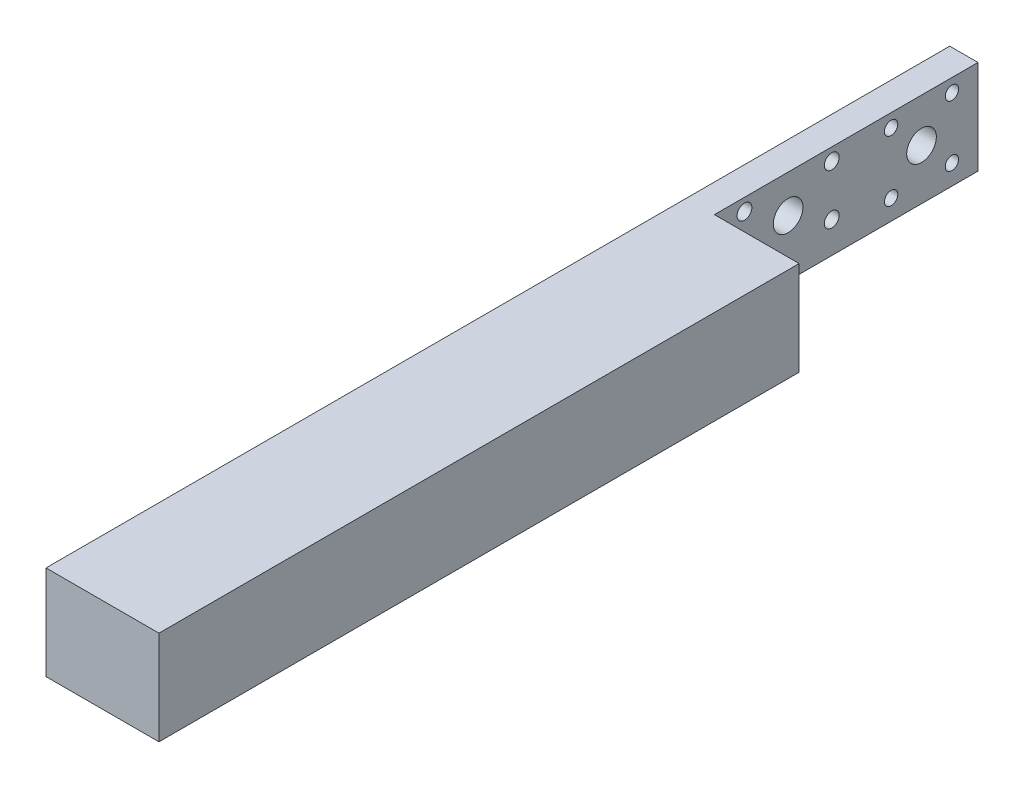
ISO-10303-21;
HEADER;
FILE_DESCRIPTION(('STEP AP214'),'2;1');
FILE_NAME('part.step','',(''),(''),'','','');
FILE_SCHEMA(('AUTOMOTIVE_DESIGN { 1 0 10303 214 1 1 1 1 }'));
ENDSEC;
DATA;
#1=APPLICATION_CONTEXT('core data for automotive mechanical design processes');
#2=APPLICATION_PROTOCOL_DEFINITION('international standard','automotive_design',2000,#1);
#3=PRODUCT_CONTEXT('',#1,'mechanical');
#4=PRODUCT('Part','Part','',(#3));
#5=PRODUCT_RELATED_PRODUCT_CATEGORY('part','',(#4));
#6=PRODUCT_DEFINITION_FORMATION('','',#4);
#7=PRODUCT_DEFINITION_CONTEXT('part definition',#1,'design');
#8=PRODUCT_DEFINITION('design','',#6,#7);
#9=PRODUCT_DEFINITION_SHAPE('','',#8);
#10=(LENGTH_UNIT() NAMED_UNIT(*) SI_UNIT(.MILLI.,.METRE.));
#11=(NAMED_UNIT(*) PLANE_ANGLE_UNIT() SI_UNIT($,.RADIAN.));
#12=(NAMED_UNIT(*) SI_UNIT($,.STERADIAN.) SOLID_ANGLE_UNIT());
#13=UNCERTAINTY_MEASURE_WITH_UNIT(LENGTH_MEASURE(1.E-05),#10,'distance_accuracy_value','');
#14=(GEOMETRIC_REPRESENTATION_CONTEXT(3) GLOBAL_UNCERTAINTY_ASSIGNED_CONTEXT((#13)) GLOBAL_UNIT_ASSIGNED_CONTEXT((#10,
#11,#12)) REPRESENTATION_CONTEXT('',''));
#15=CARTESIAN_POINT('',(0.,0.,0.));
#16=DIRECTION('',(0.,0.,1.));
#17=DIRECTION('',(1.,0.,0.));
#18=AXIS2_PLACEMENT_3D('',#15,#16,#17);
#19=CARTESIAN_POINT('',(19.05,19.05,304.8));
#20=DIRECTION('',(-1.,0.,0.));
#21=DIRECTION('',(0.,-1.,0.));
#22=AXIS2_PLACEMENT_3D('',#19,#20,#21);
#23=PLANE('',#22);
#24=DIRECTION('',(0.,-1.,0.));
#25=VECTOR('',#24,1.);
#26=CARTESIAN_POINT('',(19.05,19.05,88.9));
#27=LINE('',#26,#25);
#28=CARTESIAN_POINT('',(19.05,12.7,88.9));
#29=VERTEX_POINT('',#28);
#30=CARTESIAN_POINT('',(19.05,-19.05,88.9));
#31=VERTEX_POINT('',#30);
#32=EDGE_CURVE('E139',#29,#31,#27,.T.);
#33=ORIENTED_EDGE('',*,*,#32,.F.);
#34=DIRECTION('',(0.,0.,1.));
#35=VECTOR('',#34,1.);
#36=CARTESIAN_POINT('',(19.05,12.7,0.));
#37=LINE('',#36,#35);
#38=CARTESIAN_POINT('',(19.05,12.7,304.8));
#39=VERTEX_POINT('',#38);
#40=EDGE_CURVE('E49',#29,#39,#37,.T.);
#41=ORIENTED_EDGE('',*,*,#40,.T.);
#42=DIRECTION('',(0.,1.,0.));
#43=VECTOR('',#42,1.);
#44=CARTESIAN_POINT('',(19.05,19.05,304.8));
#45=LINE('',#44,#43);
#46=CARTESIAN_POINT('',(19.05,-19.05,304.8));
#47=VERTEX_POINT('',#46);
#48=EDGE_CURVE('E110',#47,#39,#45,.T.);
#49=ORIENTED_EDGE('',*,*,#48,.F.);
#50=DIRECTION('',(0.,0.,-1.));
#51=VECTOR('',#50,1.);
#52=CARTESIAN_POINT('',(19.05,-19.05,304.8));
#53=LINE('',#52,#51);
#54=EDGE_CURVE('E119',#47,#31,#53,.T.);
#55=ORIENTED_EDGE('',*,*,#54,.T.);
#56=EDGE_LOOP('',(#33,#41,#49,#55));
#57=FACE_BOUND('',#56,.T.);
#58=ADVANCED_FACE('F35',(#57),#23,.F.);
#59=CARTESIAN_POINT('',(-19.05,19.05,304.8));
#60=DIRECTION('',(1.,0.,0.));
#61=DIRECTION('',(0.,1.,0.));
#62=AXIS2_PLACEMENT_3D('',#59,#60,#61);
#63=PLANE('',#62);
#64=CARTESIAN_POINT('',(-19.05,8.25304832720505,8.79695167279517));
#65=DIRECTION('',(1.,0.,0.));
#66=DIRECTION('',(0.,0.,-1.));
#67=AXIS2_PLACEMENT_3D('',#64,#65,#66);
#68=CIRCLE('',#67,2.25);
#69=CARTESIAN_POINT('',(-19.05,8.25304832720507,6.54695167279517));
#70=VERTEX_POINT('',#69);
#71=EDGE_CURVE('E164',#70,#70,#68,.T.);
#72=ORIENTED_EDGE('',*,*,#71,.T.);
#73=EDGE_LOOP('',(#72));
#74=FACE_BOUND('',#73,.T.);
#75=CARTESIAN_POINT('',(-19.05,-12.2530483272049,8.79695167279506));
#76=DIRECTION('',(1.,0.,0.));
#77=DIRECTION('',(0.,-1.,0.));
#78=AXIS2_PLACEMENT_3D('',#75,#76,#77);
#79=CIRCLE('',#78,2.25);
#80=CARTESIAN_POINT('',(-19.05,-14.5030483272049,8.79695167279506));
#81=VERTEX_POINT('',#80);
#82=EDGE_CURVE('E167',#81,#81,#79,.T.);
#83=ORIENTED_EDGE('',*,*,#82,.T.);
#84=EDGE_LOOP('',(#83));
#85=FACE_BOUND('',#84,.T.);
#86=CARTESIAN_POINT('',(-19.05,-12.253048327205,29.3030483272049));
#87=DIRECTION('',(1.,0.,0.));
#88=DIRECTION('',(0.,0.,1.));
#89=AXIS2_PLACEMENT_3D('',#86,#87,#88);
#90=CIRCLE('',#89,2.25);
#91=CARTESIAN_POINT('',(-19.05,-12.253048327205,31.5530483272049));
#92=VERTEX_POINT('',#91);
#93=EDGE_CURVE('E170',#92,#92,#90,.T.);
#94=ORIENTED_EDGE('',*,*,#93,.T.);
#95=EDGE_LOOP('',(#94));
#96=FACE_BOUND('',#95,.T.);
#97=CARTESIAN_POINT('',(-19.05,8.25304832720494,29.3030483272049));
#98=DIRECTION('',(1.,0.,0.));
#99=DIRECTION('',(0.,1.,0.));
#100=AXIS2_PLACEMENT_3D('',#97,#98,#99);
#101=CIRCLE('',#100,2.25);
#102=CARTESIAN_POINT('',(-19.05,10.5030483272049,29.3030483272049));
#103=VERTEX_POINT('',#102);
#104=EDGE_CURVE('E173',#103,#103,#101,.T.);
#105=ORIENTED_EDGE('',*,*,#104,.T.);
#106=EDGE_LOOP('',(#105));
#107=FACE_BOUND('',#106,.T.);
#108=CARTESIAN_POINT('',(-19.05,8.49798229439197,49.3311901931973));
#109=DIRECTION('',(1.,0.,0.));
#110=DIRECTION('',(0.,-0.499999999999992,-0.866025403784443));
#111=AXIS2_PLACEMENT_3D('',#108,#109,#110);
#112=CIRCLE('',#111,2.49999999999999);
#113=CARTESIAN_POINT('',(-19.05,7.24798229439199,47.1661266837362));
#114=VERTEX_POINT('',#113);
#115=EDGE_CURVE('E176',#114,#114,#112,.T.);
#116=ORIENTED_EDGE('',*,*,#115,.T.);
#117=EDGE_LOOP('',(#116));
#118=FACE_BOUND('',#117,.T.);
#119=CARTESIAN_POINT('',(-19.05,-8.49787205896678,49.3311265487449));
#120=DIRECTION('',(1.,0.,0.));
#121=DIRECTION('',(0.,-1.,0.));
#122=AXIS2_PLACEMENT_3D('',#119,#120,#121);
#123=CIRCLE('',#122,2.49999999999999);
#124=CARTESIAN_POINT('',(-19.05,-10.9978720589668,49.3311265487449));
#125=VERTEX_POINT('',#124);
#126=EDGE_CURVE('E179',#125,#125,#123,.T.);
#127=ORIENTED_EDGE('',*,*,#126,.T.);
#128=EDGE_LOOP('',(#127));
#129=FACE_BOUND('',#128,.T.);
#130=CARTESIAN_POINT('',(-19.05,-8.49798229439187,78.7688098068027));
#131=DIRECTION('',(1.,0.,0.));
#132=DIRECTION('',(0.,0.499999999999998,0.86602540378444));
#133=AXIS2_PLACEMENT_3D('',#130,#131,#132);
#134=CIRCLE('',#133,2.49999999999999);
#135=CARTESIAN_POINT('',(-19.05,-7.24798229439188,80.9338733162638));
#136=VERTEX_POINT('',#135);
#137=EDGE_CURVE('E182',#136,#136,#134,.T.);
#138=ORIENTED_EDGE('',*,*,#137,.T.);
#139=EDGE_LOOP('',(#138));
#140=FACE_BOUND('',#139,.T.);
#141=CARTESIAN_POINT('',(-19.05,8.49787205896678,78.7688734512551));
#142=DIRECTION('',(1.,0.,0.));
#143=DIRECTION('',(0.,1.,0.));
#144=AXIS2_PLACEMENT_3D('',#141,#142,#143);
#145=CIRCLE('',#144,2.49999999999999);
#146=CARTESIAN_POINT('',(-19.05,10.9978720589668,78.7688734512551));
#147=VERTEX_POINT('',#146);
#148=EDGE_CURVE('E185',#147,#147,#145,.T.);
#149=ORIENTED_EDGE('',*,*,#148,.T.);
#150=EDGE_LOOP('',(#149));
#151=FACE_BOUND('',#150,.T.);
#152=CARTESIAN_POINT('',(-19.05,0.,64.05));
#153=DIRECTION('',(1.,0.,0.));
#154=DIRECTION('',(0.,1.,0.));
#155=AXIS2_PLACEMENT_3D('',#152,#153,#154);
#156=CIRCLE('',#155,5.);
#157=CARTESIAN_POINT('',(-19.05,5.,64.05));
#158=VERTEX_POINT('',#157);
#159=EDGE_CURVE('E113',#158,#158,#156,.T.);
#160=ORIENTED_EDGE('',*,*,#159,.T.);
#161=EDGE_LOOP('',(#160));
#162=FACE_BOUND('',#161,.T.);
#163=CARTESIAN_POINT('',(-19.05,-2.,19.05));
#164=DIRECTION('',(1.,0.,0.));
#165=DIRECTION('',(0.,1.,0.));
#166=AXIS2_PLACEMENT_3D('',#163,#164,#165);
#167=CIRCLE('',#166,5.);
#168=CARTESIAN_POINT('',(-19.05,3.,19.05));
#169=VERTEX_POINT('',#168);
#170=EDGE_CURVE('E108',#169,#169,#167,.T.);
#171=ORIENTED_EDGE('',*,*,#170,.T.);
#172=EDGE_LOOP('',(#171));
#173=FACE_BOUND('',#172,.T.);
#174=DIRECTION('',(0.,-1.,0.));
#175=VECTOR('',#174,1.);
#176=CARTESIAN_POINT('',(-19.05,19.05,304.8));
#177=LINE('',#176,#175);
#178=CARTESIAN_POINT('',(-19.05,12.7,304.8));
#179=VERTEX_POINT('',#178);
#180=CARTESIAN_POINT('',(-19.05,-19.05,304.8));
#181=VERTEX_POINT('',#180);
#182=EDGE_CURVE('E102',#179,#181,#177,.T.);
#183=ORIENTED_EDGE('',*,*,#182,.F.);
#184=DIRECTION('',(0.,0.,1.));
#185=VECTOR('',#184,1.);
#186=CARTESIAN_POINT('',(-19.05,12.7,0.));
#187=LINE('',#186,#185);
#188=CARTESIAN_POINT('',(-19.05,12.7,0.));
#189=VERTEX_POINT('',#188);
#190=EDGE_CURVE('E88',#189,#179,#187,.T.);
#191=ORIENTED_EDGE('',*,*,#190,.F.);
#192=DIRECTION('',(0.,-1.,0.));
#193=VECTOR('',#192,1.);
#194=CARTESIAN_POINT('',(-19.05,19.05,0.));
#195=LINE('',#194,#193);
#196=CARTESIAN_POINT('',(-19.05,-19.05,0.));
#197=VERTEX_POINT('',#196);
#198=EDGE_CURVE('E100',#189,#197,#195,.T.);
#199=ORIENTED_EDGE('',*,*,#198,.T.);
#200=DIRECTION('',(0.,0.,-1.));
#201=VECTOR('',#200,1.);
#202=CARTESIAN_POINT('',(-19.05,-19.05,304.8));
#203=LINE('',#202,#201);
#204=EDGE_CURVE('E42',#181,#197,#203,.T.);
#205=ORIENTED_EDGE('',*,*,#204,.F.);
#206=EDGE_LOOP('',(#183,#191,#199,#205));
#207=FACE_BOUND('',#206,.T.);
#208=ADVANCED_FACE('F98',(#74,#85,#96,#107,#118,#129,#140,#151,#162,#173,#207),#63,.F.);
#209=CARTESIAN_POINT('',(-19.05,-19.05,304.8));
#210=DIRECTION('',(0.,1.,0.));
#211=DIRECTION('',(0.,0.,1.));
#212=AXIS2_PLACEMENT_3D('',#209,#210,#211);
#213=PLANE('',#212);
#214=DIRECTION('',(0.,0.,-1.));
#215=VECTOR('',#214,1.);
#216=CARTESIAN_POINT('',(-9.52499999999999,-19.05,0.));
#217=LINE('',#216,#215);
#218=CARTESIAN_POINT('',(-9.52499999999999,-19.05,88.9));
#219=VERTEX_POINT('',#218);
#220=CARTESIAN_POINT('',(-9.525,-19.05,0.));
#221=VERTEX_POINT('',#220);
#222=EDGE_CURVE('E56',#219,#221,#217,.T.);
#223=ORIENTED_EDGE('',*,*,#222,.F.);
#224=DIRECTION('',(1.,0.,0.));
#225=VECTOR('',#224,1.);
#226=CARTESIAN_POINT('',(-9.52499999999999,-19.05,88.9));
#227=LINE('',#226,#225);
#228=EDGE_CURVE('E125',#219,#31,#227,.T.);
#229=ORIENTED_EDGE('',*,*,#228,.T.);
#230=ORIENTED_EDGE('',*,*,#54,.F.);
#231=DIRECTION('',(1.,0.,0.));
#232=VECTOR('',#231,1.);
#233=CARTESIAN_POINT('',(-19.05,-19.05,304.8));
#234=LINE('',#233,#232);
#235=EDGE_CURVE('E116',#181,#47,#234,.T.);
#236=ORIENTED_EDGE('',*,*,#235,.F.);
#237=ORIENTED_EDGE('',*,*,#204,.T.);
#238=DIRECTION('',(1.,0.,0.));
#239=VECTOR('',#238,1.);
#240=CARTESIAN_POINT('',(-19.05,-19.05,0.));
#241=LINE('',#240,#239);
#242=EDGE_CURVE('E107',#197,#221,#241,.T.);
#243=ORIENTED_EDGE('',*,*,#242,.T.);
#244=EDGE_LOOP('',(#223,#229,#230,#236,#237,#243));
#245=FACE_BOUND('',#244,.T.);
#246=ADVANCED_FACE('F195',(#245),#213,.F.);
#247=CARTESIAN_POINT('',(0.,0.,304.8));
#248=DIRECTION('',(0.,0.,1.));
#249=DIRECTION('',(1.,0.,0.));
#250=AXIS2_PLACEMENT_3D('',#247,#248,#249);
#251=PLANE('',#250);
#252=DIRECTION('',(1.,0.,0.));
#253=VECTOR('',#252,1.);
#254=CARTESIAN_POINT('',(19.05,12.7,304.8));
#255=LINE('',#254,#253);
#256=EDGE_CURVE('E94',#179,#39,#255,.T.);
#257=ORIENTED_EDGE('',*,*,#256,.F.);
#258=ORIENTED_EDGE('',*,*,#182,.T.);
#259=ORIENTED_EDGE('',*,*,#235,.T.);
#260=ORIENTED_EDGE('',*,*,#48,.T.);
#261=EDGE_LOOP('',(#257,#258,#259,#260));
#262=FACE_BOUND('',#261,.T.);
#263=ADVANCED_FACE('F193',(#262),#251,.T.);
#264=CARTESIAN_POINT('',(0.,0.,0.));
#265=DIRECTION('',(0.,0.,1.));
#266=DIRECTION('',(1.,0.,0.));
#267=AXIS2_PLACEMENT_3D('',#264,#265,#266);
#268=PLANE('',#267);
#269=ORIENTED_EDGE('',*,*,#198,.F.);
#270=DIRECTION('',(1.,0.,0.));
#271=VECTOR('',#270,1.);
#272=CARTESIAN_POINT('',(19.05,12.7,0.));
#273=LINE('',#272,#271);
#274=CARTESIAN_POINT('',(-9.52499999999999,12.7,0.));
#275=VERTEX_POINT('',#274);
#276=EDGE_CURVE('E85',#189,#275,#273,.T.);
#277=ORIENTED_EDGE('',*,*,#276,.T.);
#278=DIRECTION('',(0.,1.,0.));
#279=VECTOR('',#278,1.);
#280=CARTESIAN_POINT('',(-9.525,19.05,0.));
#281=LINE('',#280,#279);
#282=EDGE_CURVE('E202',#221,#275,#281,.T.);
#283=ORIENTED_EDGE('',*,*,#282,.F.);
#284=ORIENTED_EDGE('',*,*,#242,.F.);
#285=EDGE_LOOP('',(#269,#277,#283,#284));
#286=FACE_BOUND('',#285,.T.);
#287=ADVANCED_FACE('F105',(#286),#268,.F.);
#288=CARTESIAN_POINT('',(-19.05,-2.,19.05));
#289=DIRECTION('',(1.,0.,0.));
#290=DIRECTION('',(0.,1.,0.));
#291=AXIS2_PLACEMENT_3D('',#288,#289,#290);
#292=CYLINDRICAL_SURFACE('',#291,5.);
#293=CARTESIAN_POINT('',(-9.525,-2.,19.05));
#294=DIRECTION('',(-1.,0.,0.));
#295=DIRECTION('',(0.,-1.,0.));
#296=AXIS2_PLACEMENT_3D('',#293,#294,#295);
#297=CIRCLE('',#296,5.);
#298=CARTESIAN_POINT('',(-9.52499999999999,-7.,19.05));
#299=VERTEX_POINT('',#298);
#300=EDGE_CURVE('E161',#299,#299,#297,.F.);
#301=ORIENTED_EDGE('',*,*,#300,.T.);
#302=EDGE_LOOP('',(#301));
#303=FACE_BOUND('',#302,.T.);
#304=ORIENTED_EDGE('',*,*,#170,.F.);
#305=EDGE_LOOP('',(#304));
#306=FACE_BOUND('',#305,.T.);
#307=ADVANCED_FACE('F236',(#303,#306),#292,.F.);
#308=CARTESIAN_POINT('',(-19.05,0.,64.05));
#309=DIRECTION('',(1.,0.,0.));
#310=DIRECTION('',(0.,1.,0.));
#311=AXIS2_PLACEMENT_3D('',#308,#309,#310);
#312=CYLINDRICAL_SURFACE('',#311,5.);
#313=CARTESIAN_POINT('',(-9.525,0.,64.05));
#314=DIRECTION('',(-1.,0.,0.));
#315=DIRECTION('',(0.,-1.,0.));
#316=AXIS2_PLACEMENT_3D('',#313,#314,#315);
#317=CIRCLE('',#316,5.);
#318=CARTESIAN_POINT('',(-9.52499999999999,-5.00000000000001,64.05));
#319=VERTEX_POINT('',#318);
#320=EDGE_CURVE('E158',#319,#319,#317,.F.);
#321=ORIENTED_EDGE('',*,*,#320,.T.);
#322=EDGE_LOOP('',(#321));
#323=FACE_BOUND('',#322,.T.);
#324=ORIENTED_EDGE('',*,*,#159,.F.);
#325=EDGE_LOOP('',(#324));
#326=FACE_BOUND('',#325,.T.);
#327=ADVANCED_FACE('F240',(#323,#326),#312,.F.);
#328=CARTESIAN_POINT('',(-19.05,8.49787205896678,78.7688734512551));
#329=DIRECTION('',(1.,0.,0.));
#330=DIRECTION('',(0.,1.,0.));
#331=AXIS2_PLACEMENT_3D('',#328,#329,#330);
#332=CYLINDRICAL_SURFACE('',#331,2.49999999999999);
#333=CARTESIAN_POINT('',(-9.525,8.49787205896678,78.7688734512551));
#334=DIRECTION('',(-1.,0.,0.));
#335=DIRECTION('',(0.,-1.,0.));
#336=AXIS2_PLACEMENT_3D('',#333,#334,#335);
#337=CIRCLE('',#336,2.49999999999999);
#338=CARTESIAN_POINT('',(-9.525,5.99787205896678,78.7688734512551));
#339=VERTEX_POINT('',#338);
#340=EDGE_CURVE('E155',#339,#339,#337,.F.);
#341=ORIENTED_EDGE('',*,*,#340,.T.);
#342=EDGE_LOOP('',(#341));
#343=FACE_BOUND('',#342,.T.);
#344=ORIENTED_EDGE('',*,*,#148,.F.);
#345=EDGE_LOOP('',(#344));
#346=FACE_BOUND('',#345,.T.);
#347=ADVANCED_FACE('F244',(#343,#346),#332,.F.);
#348=CARTESIAN_POINT('',(-19.05,-8.49798229439187,78.7688098068027));
#349=DIRECTION('',(1.,0.,0.));
#350=DIRECTION('',(0.,1.,0.));
#351=AXIS2_PLACEMENT_3D('',#348,#349,#350);
#352=CYLINDRICAL_SURFACE('',#351,2.49999999999999);
#353=CARTESIAN_POINT('',(-9.52499999999999,-8.49798229439187,78.7688098068027));
#354=DIRECTION('',(-1.,0.,0.));
#355=DIRECTION('',(0.,-1.,0.));
#356=AXIS2_PLACEMENT_3D('',#353,#354,#355);
#357=CIRCLE('',#356,2.49999999999999);
#358=CARTESIAN_POINT('',(-9.52499999999999,-10.9979822943919,78.7688098068027));
#359=VERTEX_POINT('',#358);
#360=EDGE_CURVE('E152',#359,#359,#357,.F.);
#361=ORIENTED_EDGE('',*,*,#360,.T.);
#362=EDGE_LOOP('',(#361));
#363=FACE_BOUND('',#362,.T.);
#364=ORIENTED_EDGE('',*,*,#137,.F.);
#365=EDGE_LOOP('',(#364));
#366=FACE_BOUND('',#365,.T.);
#367=ADVANCED_FACE('F248',(#363,#366),#352,.F.);
#368=CARTESIAN_POINT('',(-19.05,-8.49787205896678,49.3311265487449));
#369=DIRECTION('',(1.,0.,0.));
#370=DIRECTION('',(0.,1.,0.));
#371=AXIS2_PLACEMENT_3D('',#368,#369,#370);
#372=CYLINDRICAL_SURFACE('',#371,2.49999999999999);
#373=CARTESIAN_POINT('',(-9.52499999999999,-8.49787205896678,49.3311265487449));
#374=DIRECTION('',(-1.,0.,0.));
#375=DIRECTION('',(0.,-1.,0.));
#376=AXIS2_PLACEMENT_3D('',#373,#374,#375);
#377=CIRCLE('',#376,2.49999999999999);
#378=CARTESIAN_POINT('',(-9.52499999999999,-10.9978720589668,49.3311265487449));
#379=VERTEX_POINT('',#378);
#380=EDGE_CURVE('E149',#379,#379,#377,.F.);
#381=ORIENTED_EDGE('',*,*,#380,.T.);
#382=EDGE_LOOP('',(#381));
#383=FACE_BOUND('',#382,.T.);
#384=ORIENTED_EDGE('',*,*,#126,.F.);
#385=EDGE_LOOP('',(#384));
#386=FACE_BOUND('',#385,.T.);
#387=ADVANCED_FACE('F252',(#383,#386),#372,.F.);
#388=CARTESIAN_POINT('',(-19.05,8.49798229439197,49.3311901931973));
#389=DIRECTION('',(1.,0.,0.));
#390=DIRECTION('',(0.,1.,0.));
#391=AXIS2_PLACEMENT_3D('',#388,#389,#390);
#392=CYLINDRICAL_SURFACE('',#391,2.49999999999999);
#393=CARTESIAN_POINT('',(-9.525,8.49798229439197,49.3311901931973));
#394=DIRECTION('',(-1.,0.,0.));
#395=DIRECTION('',(0.,-1.,0.));
#396=AXIS2_PLACEMENT_3D('',#393,#394,#395);
#397=CIRCLE('',#396,2.49999999999999);
#398=CARTESIAN_POINT('',(-9.525,5.99798229439198,49.3311901931973));
#399=VERTEX_POINT('',#398);
#400=EDGE_CURVE('E146',#399,#399,#397,.F.);
#401=ORIENTED_EDGE('',*,*,#400,.T.);
#402=EDGE_LOOP('',(#401));
#403=FACE_BOUND('',#402,.T.);
#404=ORIENTED_EDGE('',*,*,#115,.F.);
#405=EDGE_LOOP('',(#404));
#406=FACE_BOUND('',#405,.T.);
#407=ADVANCED_FACE('F256',(#403,#406),#392,.F.);
#408=CARTESIAN_POINT('',(-19.05,8.25304832720494,29.3030483272049));
#409=DIRECTION('',(1.,0.,0.));
#410=DIRECTION('',(0.,1.,0.));
#411=AXIS2_PLACEMENT_3D('',#408,#409,#410);
#412=CYLINDRICAL_SURFACE('',#411,2.25);
#413=CARTESIAN_POINT('',(-9.525,8.25304832720494,29.3030483272049));
#414=DIRECTION('',(-1.,0.,0.));
#415=DIRECTION('',(0.,-1.,0.));
#416=AXIS2_PLACEMENT_3D('',#413,#414,#415);
#417=CIRCLE('',#416,2.25);
#418=CARTESIAN_POINT('',(-9.525,6.00304832720494,29.3030483272049));
#419=VERTEX_POINT('',#418);
#420=EDGE_CURVE('E143',#419,#419,#417,.F.);
#421=ORIENTED_EDGE('',*,*,#420,.T.);
#422=EDGE_LOOP('',(#421));
#423=FACE_BOUND('',#422,.T.);
#424=ORIENTED_EDGE('',*,*,#104,.F.);
#425=EDGE_LOOP('',(#424));
#426=FACE_BOUND('',#425,.T.);
#427=ADVANCED_FACE('F260',(#423,#426),#412,.F.);
#428=CARTESIAN_POINT('',(-19.05,-12.253048327205,29.3030483272049));
#429=DIRECTION('',(1.,0.,0.));
#430=DIRECTION('',(0.,1.,0.));
#431=AXIS2_PLACEMENT_3D('',#428,#429,#430);
#432=CYLINDRICAL_SURFACE('',#431,2.25);
#433=CARTESIAN_POINT('',(-9.52499999999999,-12.253048327205,29.3030483272049));
#434=DIRECTION('',(-1.,0.,0.));
#435=DIRECTION('',(0.,-1.,0.));
#436=AXIS2_PLACEMENT_3D('',#433,#434,#435);
#437=CIRCLE('',#436,2.25);
#438=CARTESIAN_POINT('',(-9.52499999999999,-14.503048327205,29.3030483272049));
#439=VERTEX_POINT('',#438);
#440=EDGE_CURVE('E129',#439,#439,#437,.F.);
#441=ORIENTED_EDGE('',*,*,#440,.T.);
#442=EDGE_LOOP('',(#441));
#443=FACE_BOUND('',#442,.T.);
#444=ORIENTED_EDGE('',*,*,#93,.F.);
#445=EDGE_LOOP('',(#444));
#446=FACE_BOUND('',#445,.T.);
#447=ADVANCED_FACE('F264',(#443,#446),#432,.F.);
#448=CARTESIAN_POINT('',(-19.05,-12.2530483272049,8.79695167279506));
#449=DIRECTION('',(1.,0.,0.));
#450=DIRECTION('',(0.,1.,0.));
#451=AXIS2_PLACEMENT_3D('',#448,#449,#450);
#452=CYLINDRICAL_SURFACE('',#451,2.25);
#453=CARTESIAN_POINT('',(-9.52499999999999,-12.2530483272049,8.79695167279506));
#454=DIRECTION('',(-1.,0.,0.));
#455=DIRECTION('',(0.,-1.,0.));
#456=AXIS2_PLACEMENT_3D('',#453,#454,#455);
#457=CIRCLE('',#456,2.25);
#458=CARTESIAN_POINT('',(-9.52499999999999,-14.5030483272049,8.79695167279506));
#459=VERTEX_POINT('',#458);
#460=EDGE_CURVE('E124',#459,#459,#457,.F.);
#461=ORIENTED_EDGE('',*,*,#460,.T.);
#462=EDGE_LOOP('',(#461));
#463=FACE_BOUND('',#462,.T.);
#464=ORIENTED_EDGE('',*,*,#82,.F.);
#465=EDGE_LOOP('',(#464));
#466=FACE_BOUND('',#465,.T.);
#467=ADVANCED_FACE('F268',(#463,#466),#452,.F.);
#468=CARTESIAN_POINT('',(-19.05,8.25304832720505,8.79695167279517));
#469=DIRECTION('',(1.,0.,0.));
#470=DIRECTION('',(0.,1.,0.));
#471=AXIS2_PLACEMENT_3D('',#468,#469,#470);
#472=CYLINDRICAL_SURFACE('',#471,2.25);
#473=CARTESIAN_POINT('',(-9.525,8.25304832720505,8.79695167279517));
#474=DIRECTION('',(-1.,0.,0.));
#475=DIRECTION('',(0.,-1.,0.));
#476=AXIS2_PLACEMENT_3D('',#473,#474,#475);
#477=CIRCLE('',#476,2.25);
#478=CARTESIAN_POINT('',(-9.525,6.00304832720505,8.79695167279517));
#479=VERTEX_POINT('',#478);
#480=EDGE_CURVE('E122',#479,#479,#477,.F.);
#481=ORIENTED_EDGE('',*,*,#480,.T.);
#482=EDGE_LOOP('',(#481));
#483=FACE_BOUND('',#482,.T.);
#484=ORIENTED_EDGE('',*,*,#71,.F.);
#485=EDGE_LOOP('',(#484));
#486=FACE_BOUND('',#485,.T.);
#487=ADVANCED_FACE('F217',(#483,#486),#472,.F.);
#488=CARTESIAN_POINT('',(-9.525,0.,0.));
#489=DIRECTION('',(-1.,0.,0.));
#490=DIRECTION('',(0.,-1.,0.));
#491=AXIS2_PLACEMENT_3D('',#488,#489,#490);
#492=PLANE('',#491);
#493=ORIENTED_EDGE('',*,*,#320,.F.);
#494=EDGE_LOOP('',(#493));
#495=FACE_BOUND('',#494,.T.);
#496=ORIENTED_EDGE('',*,*,#360,.F.);
#497=EDGE_LOOP('',(#496));
#498=FACE_BOUND('',#497,.T.);
#499=ORIENTED_EDGE('',*,*,#400,.F.);
#500=EDGE_LOOP('',(#499));
#501=FACE_BOUND('',#500,.T.);
#502=ORIENTED_EDGE('',*,*,#440,.F.);
#503=EDGE_LOOP('',(#502));
#504=FACE_BOUND('',#503,.T.);
#505=ORIENTED_EDGE('',*,*,#480,.F.);
#506=EDGE_LOOP('',(#505));
#507=FACE_BOUND('',#506,.T.);
#508=ORIENTED_EDGE('',*,*,#282,.T.);
#509=DIRECTION('',(0.,0.,1.));
#510=VECTOR('',#509,1.);
#511=CARTESIAN_POINT('',(-9.525,12.7,0.));
#512=LINE('',#511,#510);
#513=CARTESIAN_POINT('',(-9.525,12.7,88.9));
#514=VERTEX_POINT('',#513);
#515=EDGE_CURVE('E91',#275,#514,#512,.T.);
#516=ORIENTED_EDGE('',*,*,#515,.T.);
#517=DIRECTION('',(0.,-1.,0.));
#518=VECTOR('',#517,1.);
#519=CARTESIAN_POINT('',(-9.525,19.05,88.9));
#520=LINE('',#519,#518);
#521=EDGE_CURVE('E136',#514,#219,#520,.T.);
#522=ORIENTED_EDGE('',*,*,#521,.T.);
#523=ORIENTED_EDGE('',*,*,#222,.T.);
#524=EDGE_LOOP('',(#508,#516,#522,#523));
#525=FACE_BOUND('',#524,.T.);
#526=ORIENTED_EDGE('',*,*,#460,.F.);
#527=EDGE_LOOP('',(#526));
#528=FACE_BOUND('',#527,.T.);
#529=ORIENTED_EDGE('',*,*,#420,.F.);
#530=EDGE_LOOP('',(#529));
#531=FACE_BOUND('',#530,.T.);
#532=ORIENTED_EDGE('',*,*,#380,.F.);
#533=EDGE_LOOP('',(#532));
#534=FACE_BOUND('',#533,.T.);
#535=ORIENTED_EDGE('',*,*,#340,.F.);
#536=EDGE_LOOP('',(#535));
#537=FACE_BOUND('',#536,.T.);
#538=ORIENTED_EDGE('',*,*,#300,.F.);
#539=EDGE_LOOP('',(#538));
#540=FACE_BOUND('',#539,.T.);
#541=ADVANCED_FACE('F205',(#495,#498,#501,#504,#507,#525,#528,#531,#534,#537,#540),#492,.F.);
#542=CARTESIAN_POINT('',(-9.525,19.05,88.9));
#543=DIRECTION('',(0.,0.,1.));
#544=DIRECTION('',(1.,0.,0.));
#545=AXIS2_PLACEMENT_3D('',#542,#543,#544);
#546=PLANE('',#545);
#547=ORIENTED_EDGE('',*,*,#521,.F.);
#548=DIRECTION('',(1.,0.,0.));
#549=VECTOR('',#548,1.);
#550=CARTESIAN_POINT('',(-9.525,12.7,88.9));
#551=LINE('',#550,#549);
#552=EDGE_CURVE('E11',#514,#29,#551,.T.);
#553=ORIENTED_EDGE('',*,*,#552,.T.);
#554=ORIENTED_EDGE('',*,*,#32,.T.);
#555=ORIENTED_EDGE('',*,*,#228,.F.);
#556=EDGE_LOOP('',(#547,#553,#554,#555));
#557=FACE_BOUND('',#556,.T.);
#558=ADVANCED_FACE('F208',(#557),#546,.F.);
#559=CARTESIAN_POINT('',(19.05,12.7,0.));
#560=DIRECTION('',(0.,-1.,0.));
#561=DIRECTION('',(1.,0.,0.));
#562=AXIS2_PLACEMENT_3D('',#559,#560,#561);
#563=PLANE('',#562);
#564=ORIENTED_EDGE('',*,*,#276,.F.);
#565=ORIENTED_EDGE('',*,*,#190,.T.);
#566=ORIENTED_EDGE('',*,*,#256,.T.);
#567=ORIENTED_EDGE('',*,*,#40,.F.);
#568=ORIENTED_EDGE('',*,*,#552,.F.);
#569=ORIENTED_EDGE('',*,*,#515,.F.);
#570=EDGE_LOOP('',(#564,#565,#566,#567,#568,#569));
#571=FACE_BOUND('',#570,.T.);
#572=ADVANCED_FACE('F87',(#571),#563,.F.);
#573=CLOSED_SHELL('',(#58,#208,#246,#263,#287,#307,#327,#347,#367,#387,#407,#427,#447,#467,#487,
#541,#558,#572));
#574=MANIFOLD_SOLID_BREP('B2',#573);
#575=ADVANCED_BREP_SHAPE_REPRESENTATION('',(#18,#574),#14);
#576=SHAPE_DEFINITION_REPRESENTATION(#9,#575);
ENDSEC;
END-ISO-10303-21;
